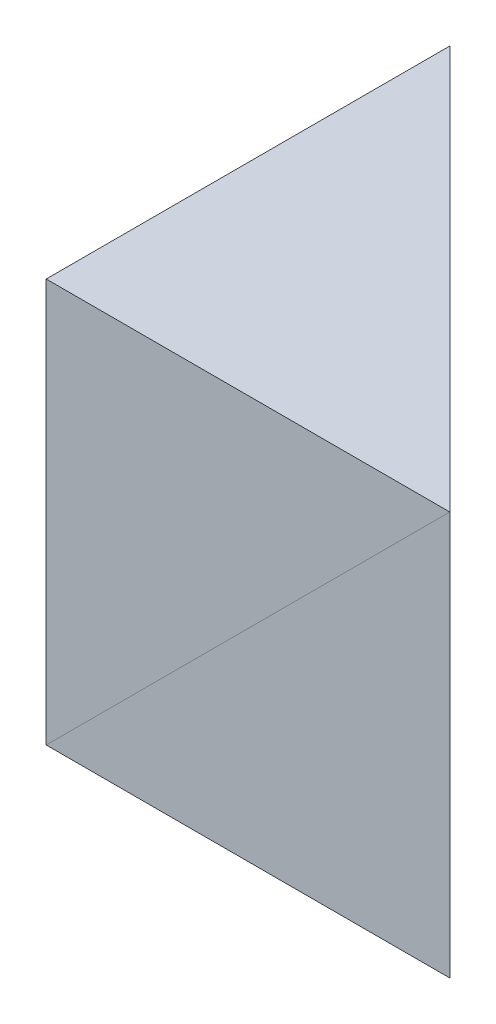
ISO-10303-21;
HEADER;
FILE_DESCRIPTION(('STEP AP214'),'2;1');
FILE_NAME('part.step','',(''),(''),'','','');
FILE_SCHEMA(('AUTOMOTIVE_DESIGN { 1 0 10303 214 1 1 1 1 }'));
ENDSEC;
DATA;
#1=APPLICATION_CONTEXT('core data for automotive mechanical design processes');
#2=APPLICATION_PROTOCOL_DEFINITION('international standard','automotive_design',2000,#1);
#3=PRODUCT_CONTEXT('',#1,'mechanical');
#4=PRODUCT('Part','Part','',(#3));
#5=PRODUCT_RELATED_PRODUCT_CATEGORY('part','',(#4));
#6=PRODUCT_DEFINITION_FORMATION('','',#4);
#7=PRODUCT_DEFINITION_CONTEXT('part definition',#1,'design');
#8=PRODUCT_DEFINITION('design','',#6,#7);
#9=PRODUCT_DEFINITION_SHAPE('','',#8);
#10=(LENGTH_UNIT() NAMED_UNIT(*) SI_UNIT(.MILLI.,.METRE.));
#11=(NAMED_UNIT(*) PLANE_ANGLE_UNIT() SI_UNIT($,.RADIAN.));
#12=(NAMED_UNIT(*) SI_UNIT($,.STERADIAN.) SOLID_ANGLE_UNIT());
#13=UNCERTAINTY_MEASURE_WITH_UNIT(LENGTH_MEASURE(1.E-05),#10,'distance_accuracy_value','');
#14=(GEOMETRIC_REPRESENTATION_CONTEXT(3) GLOBAL_UNCERTAINTY_ASSIGNED_CONTEXT((#13)) GLOBAL_UNIT_ASSIGNED_CONTEXT((#10,
#11,#12)) REPRESENTATION_CONTEXT('',''));
#15=CARTESIAN_POINT('',(0.,0.,0.));
#16=DIRECTION('',(0.,0.,1.));
#17=DIRECTION('',(1.,0.,0.));
#18=AXIS2_PLACEMENT_3D('',#15,#16,#17);
#19=CARTESIAN_POINT('',(0.,1.,0.));
#20=DIRECTION('',(0.,1.,0.));
#21=DIRECTION('',(0.,0.,1.));
#22=AXIS2_PLACEMENT_3D('',#19,#20,#21);
#23=PLANE('',#22);
#24=DIRECTION('',(-0.707106781186548,0.,-0.707106781186547));
#25=VECTOR('',#24,1.);
#26=CARTESIAN_POINT('',(1.,1.,1.));
#27=LINE('',#26,#25);
#28=CARTESIAN_POINT('',(1.,1.,1.));
#29=VERTEX_POINT('',#28);
#30=CARTESIAN_POINT('',(0.,1.,0.));
#31=VERTEX_POINT('',#30);
#32=EDGE_CURVE('E94',#29,#31,#27,.T.);
#33=ORIENTED_EDGE('',*,*,#32,.T.);
#34=DIRECTION('',(0.,0.,1.));
#35=VECTOR('',#34,1.);
#36=CARTESIAN_POINT('',(0.,1.,0.));
#37=LINE('',#36,#35);
#38=CARTESIAN_POINT('',(0.,1.,1.));
#39=VERTEX_POINT('',#38);
#40=EDGE_CURVE('E85',#31,#39,#37,.T.);
#41=ORIENTED_EDGE('',*,*,#40,.T.);
#42=DIRECTION('',(1.,0.,0.));
#43=VECTOR('',#42,1.);
#44=CARTESIAN_POINT('',(0.,1.,1.));
#45=LINE('',#44,#43);
#46=EDGE_CURVE('E91',#39,#29,#45,.T.);
#47=ORIENTED_EDGE('',*,*,#46,.T.);
#48=EDGE_LOOP('',(#33,#41,#47));
#49=FACE_BOUND('',#48,.T.);
#50=ADVANCED_FACE('F65',(#49),#23,.T.);
#51=CARTESIAN_POINT('',(0.,0.,0.));
#52=DIRECTION('',(0.,0.707106781186548,-0.707106781186547));
#53=DIRECTION('',(0.,0.707106781186547,0.707106781186548));
#54=AXIS2_PLACEMENT_3D('',#51,#52,#53);
#55=PLANE('',#54);
#56=DIRECTION('',(0.,0.707106781186547,0.707106781186548));
#57=VECTOR('',#56,1.);
#58=CARTESIAN_POINT('',(0.,0.,0.));
#59=LINE('',#58,#57);
#60=CARTESIAN_POINT('',(0.,0.,0.));
#61=VERTEX_POINT('',#60);
#62=EDGE_CURVE('E12',#61,#39,#59,.T.);
#63=ORIENTED_EDGE('',*,*,#62,.F.);
#64=DIRECTION('',(-0.577350269189626,-0.577350269189626,-0.577350269189626));
#65=VECTOR('',#64,1.);
#66=CARTESIAN_POINT('',(1.,1.,1.));
#67=LINE('',#66,#65);
#68=EDGE_CURVE('E90',#29,#61,#67,.T.);
#69=ORIENTED_EDGE('',*,*,#68,.F.);
#70=ORIENTED_EDGE('',*,*,#46,.F.);
#71=EDGE_LOOP('',(#63,#69,#70));
#72=FACE_BOUND('',#71,.T.);
#73=ADVANCED_FACE('F87',(#72),#55,.F.);
#74=CARTESIAN_POINT('',(1.,3.23205080756888,1.));
#75=DIRECTION('',(-0.707106781186547,0.,0.707106781186548));
#76=DIRECTION('',(0.707106781186548,0.,0.707106781186547));
#77=AXIS2_PLACEMENT_3D('',#74,#75,#76);
#78=PLANE('',#77);
#79=ORIENTED_EDGE('',*,*,#32,.F.);
#80=ORIENTED_EDGE('',*,*,#68,.T.);
#81=DIRECTION('',(0.,-1.,0.));
#82=VECTOR('',#81,1.);
#83=CARTESIAN_POINT('',(0.,2.23205080756888,0.));
#84=LINE('',#83,#82);
#85=EDGE_CURVE('E61',#31,#61,#84,.T.);
#86=ORIENTED_EDGE('',*,*,#85,.F.);
#87=EDGE_LOOP('',(#79,#80,#86));
#88=FACE_BOUND('',#87,.T.);
#89=ADVANCED_FACE('F96',(#88),#78,.F.);
#90=CARTESIAN_POINT('',(0.,2.23205080756888,0.));
#91=DIRECTION('',(1.,0.,0.));
#92=DIRECTION('',(0.,0.,-1.));
#93=AXIS2_PLACEMENT_3D('',#90,#91,#92);
#94=PLANE('',#93);
#95=ORIENTED_EDGE('',*,*,#40,.F.);
#96=ORIENTED_EDGE('',*,*,#85,.T.);
#97=ORIENTED_EDGE('',*,*,#62,.T.);
#98=EDGE_LOOP('',(#95,#96,#97));
#99=FACE_BOUND('',#98,.T.);
#100=ADVANCED_FACE('F108',(#99),#94,.F.);
#101=CLOSED_SHELL('',(#50,#73,#89,#100));
#102=MANIFOLD_SOLID_BREP('B2',#101);
#103=CARTESIAN_POINT('',(0.,0.,0.));
#104=DIRECTION('',(-0.707106781186547,0.707106781186548,0.));
#105=DIRECTION('',(-0.707106781186548,-0.707106781186547,0.));
#106=AXIS2_PLACEMENT_3D('',#103,#104,#105);
#107=PLANE('',#106);
#108=DIRECTION('',(-0.577350269189626,-0.577350269189626,-0.577350269189626));
#109=VECTOR('',#108,1.);
#110=CARTESIAN_POINT('',(1.,1.,1.));
#111=LINE('',#110,#109);
#112=CARTESIAN_POINT('',(1.,1.,1.));
#113=VERTEX_POINT('',#112);
#114=CARTESIAN_POINT('',(0.,0.,0.));
#115=VERTEX_POINT('',#114);
#116=EDGE_CURVE('E58',#113,#115,#111,.T.);
#117=ORIENTED_EDGE('',*,*,#116,.F.);
#118=DIRECTION('',(0.707106781186548,0.707106781186547,0.));
#119=VECTOR('',#118,1.);
#120=CARTESIAN_POINT('',(0.,0.,1.));
#121=LINE('',#120,#119);
#122=CARTESIAN_POINT('',(0.,0.,1.));
#123=VERTEX_POINT('',#122);
#124=EDGE_CURVE('E187',#123,#113,#121,.T.);
#125=ORIENTED_EDGE('',*,*,#124,.F.);
#126=DIRECTION('',(0.,0.,1.));
#127=VECTOR('',#126,1.);
#128=CARTESIAN_POINT('',(0.,0.,0.));
#129=LINE('',#128,#127);
#130=EDGE_CURVE('E195',#115,#123,#129,.T.);
#131=ORIENTED_EDGE('',*,*,#130,.F.);
#132=EDGE_LOOP('',(#117,#125,#131));
#133=FACE_BOUND('',#132,.T.);
#134=ADVANCED_FACE('F159',(#133),#107,.F.);
#135=CARTESIAN_POINT('',(0.,2.09077027517603,1.));
#136=DIRECTION('',(0.,0.,-1.));
#137=DIRECTION('',(-1.,0.,0.));
#138=AXIS2_PLACEMENT_3D('',#135,#136,#137);
#139=PLANE('',#138);
#140=ORIENTED_EDGE('',*,*,#124,.T.);
#141=DIRECTION('',(-1.,0.,0.));
#142=VECTOR('',#141,1.);
#143=CARTESIAN_POINT('',(0.,1.,1.));
#144=LINE('',#143,#142);
#145=CARTESIAN_POINT('',(0.,1.,1.));
#146=VERTEX_POINT('',#145);
#147=EDGE_CURVE('E188',#113,#146,#144,.T.);
#148=ORIENTED_EDGE('',*,*,#147,.T.);
#149=DIRECTION('',(0.,-1.,0.));
#150=VECTOR('',#149,1.);
#151=CARTESIAN_POINT('',(0.,2.09077027517603,1.));
#152=LINE('',#151,#150);
#153=EDGE_CURVE('E163',#146,#123,#152,.T.);
#154=ORIENTED_EDGE('',*,*,#153,.T.);
#155=EDGE_LOOP('',(#140,#148,#154));
#156=FACE_BOUND('',#155,.T.);
#157=ADVANCED_FACE('F186',(#156),#139,.F.);
#158=CARTESIAN_POINT('',(0.,2.09077027517603,0.));
#159=DIRECTION('',(1.,0.,0.));
#160=DIRECTION('',(0.,0.,-1.));
#161=AXIS2_PLACEMENT_3D('',#158,#159,#160);
#162=PLANE('',#161);
#163=ORIENTED_EDGE('',*,*,#153,.F.);
#164=DIRECTION('',(0.,-0.707106781186547,-0.707106781186548));
#165=VECTOR('',#164,1.);
#166=CARTESIAN_POINT('',(0.,1.04538513758801,1.04538513758801));
#167=LINE('',#166,#165);
#168=EDGE_CURVE('E166',#146,#115,#167,.T.);
#169=ORIENTED_EDGE('',*,*,#168,.T.);
#170=ORIENTED_EDGE('',*,*,#130,.T.);
#171=EDGE_LOOP('',(#163,#169,#170));
#172=FACE_BOUND('',#171,.T.);
#173=ADVANCED_FACE('F162',(#172),#162,.F.);
#174=CARTESIAN_POINT('',(0.,0.,0.));
#175=DIRECTION('',(0.,-0.707106781186548,0.707106781186547));
#176=DIRECTION('',(0.,-0.707106781186547,-0.707106781186548));
#177=AXIS2_PLACEMENT_3D('',#174,#175,#176);
#178=PLANE('',#177);
#179=ORIENTED_EDGE('',*,*,#147,.F.);
#180=ORIENTED_EDGE('',*,*,#116,.T.);
#181=ORIENTED_EDGE('',*,*,#168,.F.);
#182=EDGE_LOOP('',(#179,#180,#181));
#183=FACE_BOUND('',#182,.T.);
#184=ADVANCED_FACE('F201',(#183),#178,.F.);
#185=CLOSED_SHELL('',(#134,#157,#173,#184));
#186=MANIFOLD_SOLID_BREP('B6',#185);
#187=CARTESIAN_POINT('',(0.,0.,0.));
#188=DIRECTION('',(-0.707106781186548,0.707106781186547,0.));
#189=DIRECTION('',(-0.707106781186547,-0.707106781186548,0.));
#190=AXIS2_PLACEMENT_3D('',#187,#188,#189);
#191=PLANE('',#190);
#192=DIRECTION('',(0.,0.,1.));
#193=VECTOR('',#192,1.);
#194=CARTESIAN_POINT('',(0.,0.,0.));
#195=LINE('',#194,#193);
#196=CARTESIAN_POINT('',(0.,0.,0.));
#197=VERTEX_POINT('',#196);
#198=CARTESIAN_POINT('',(0.,0.,1.));
#199=VERTEX_POINT('',#198);
#200=EDGE_CURVE('E263',#197,#199,#195,.T.);
#201=ORIENTED_EDGE('',*,*,#200,.T.);
#202=DIRECTION('',(0.707106781186547,0.707106781186548,0.));
#203=VECTOR('',#202,1.);
#204=CARTESIAN_POINT('',(1.10355339059327,1.10355339059327,1.));
#205=LINE('',#204,#203);
#206=CARTESIAN_POINT('',(1.,1.,1.));
#207=VERTEX_POINT('',#206);
#208=EDGE_CURVE('E264',#199,#207,#205,.T.);
#209=ORIENTED_EDGE('',*,*,#208,.T.);
#210=DIRECTION('',(-0.577350269189626,-0.577350269189626,-0.577350269189626));
#211=VECTOR('',#210,1.);
#212=CARTESIAN_POINT('',(0.735702260395516,0.735702260395516,0.735702260395516));
#213=LINE('',#212,#211);
#214=EDGE_CURVE('E254',#207,#197,#213,.T.);
#215=ORIENTED_EDGE('',*,*,#214,.T.);
#216=EDGE_LOOP('',(#201,#209,#215));
#217=FACE_BOUND('',#216,.T.);
#218=ADVANCED_FACE('F231',(#217),#191,.T.);
#219=CARTESIAN_POINT('',(0.,0.,0.));
#220=DIRECTION('',(0.,1.,0.));
#221=DIRECTION('',(0.,0.,1.));
#222=AXIS2_PLACEMENT_3D('',#219,#220,#221);
#223=PLANE('',#222);
#224=ORIENTED_EDGE('',*,*,#200,.F.);
#225=DIRECTION('',(-0.707106781186548,0.,-0.707106781186548));
#226=VECTOR('',#225,1.);
#227=CARTESIAN_POINT('',(0.,0.,0.));
#228=LINE('',#227,#226);
#229=CARTESIAN_POINT('',(1.,0.,1.));
#230=VERTEX_POINT('',#229);
#231=EDGE_CURVE('E242',#230,#197,#228,.T.);
#232=ORIENTED_EDGE('',*,*,#231,.F.);
#233=DIRECTION('',(1.,0.,0.));
#234=VECTOR('',#233,1.);
#235=CARTESIAN_POINT('',(0.,0.,1.));
#236=LINE('',#235,#234);
#237=EDGE_CURVE('E160',#199,#230,#236,.T.);
#238=ORIENTED_EDGE('',*,*,#237,.F.);
#239=EDGE_LOOP('',(#224,#232,#238));
#240=FACE_BOUND('',#239,.T.);
#241=ADVANCED_FACE('F260',(#240),#223,.F.);
#242=CARTESIAN_POINT('',(0.,2.20710678118655,0.));
#243=DIRECTION('',(-0.707106781186548,0.,0.707106781186548));
#244=DIRECTION('',(0.707106781186548,0.,0.707106781186548));
#245=AXIS2_PLACEMENT_3D('',#242,#243,#244);
#246=PLANE('',#245);
#247=ORIENTED_EDGE('',*,*,#214,.F.);
#248=DIRECTION('',(0.,-1.,0.));
#249=VECTOR('',#248,1.);
#250=CARTESIAN_POINT('',(1.,2.20710678118655,1.));
#251=LINE('',#250,#249);
#252=EDGE_CURVE('E233',#207,#230,#251,.T.);
#253=ORIENTED_EDGE('',*,*,#252,.T.);
#254=ORIENTED_EDGE('',*,*,#231,.T.);
#255=EDGE_LOOP('',(#247,#253,#254));
#256=FACE_BOUND('',#255,.T.);
#257=ADVANCED_FACE('F274',(#256),#246,.F.);
#258=CARTESIAN_POINT('',(0.,2.20710678118655,1.));
#259=DIRECTION('',(0.,0.,-1.));
#260=DIRECTION('',(-1.,0.,0.));
#261=AXIS2_PLACEMENT_3D('',#258,#259,#260);
#262=PLANE('',#261);
#263=ORIENTED_EDGE('',*,*,#208,.F.);
#264=ORIENTED_EDGE('',*,*,#237,.T.);
#265=ORIENTED_EDGE('',*,*,#252,.F.);
#266=EDGE_LOOP('',(#263,#264,#265));
#267=FACE_BOUND('',#266,.T.);
#268=ADVANCED_FACE('F262',(#267),#262,.F.);
#269=CLOSED_SHELL('',(#218,#241,#257,#268));
#270=MANIFOLD_SOLID_BREP('B53',#269);
#271=ADVANCED_BREP_SHAPE_REPRESENTATION('',(#18,#102,#186,#270),#14);
#272=SHAPE_DEFINITION_REPRESENTATION(#9,#271);
ENDSEC;
END-ISO-10303-21;
